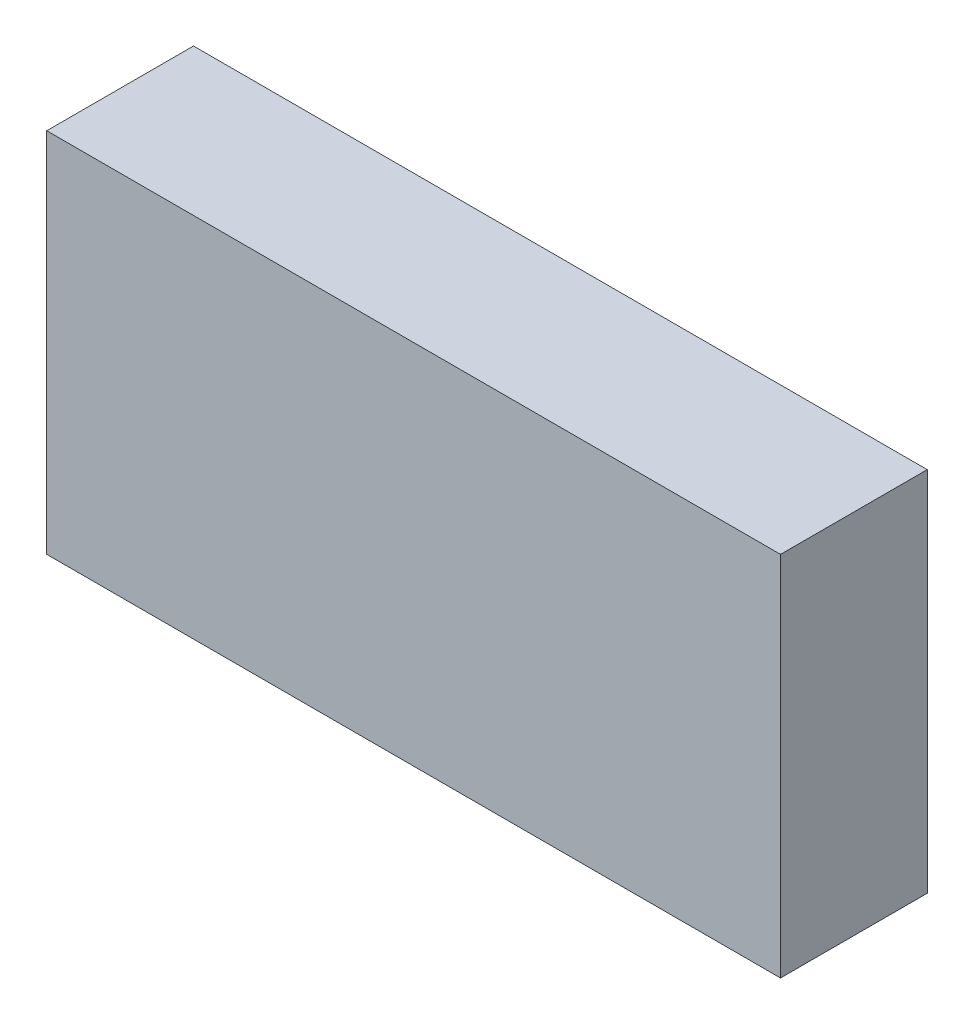
ISO-10303-21;
HEADER;
FILE_DESCRIPTION(('STEP AP214'),'2;1');
FILE_NAME('part.step','',(''),(''),'','','');
FILE_SCHEMA(('AUTOMOTIVE_DESIGN { 1 0 10303 214 1 1 1 1 }'));
ENDSEC;
DATA;
#1=APPLICATION_CONTEXT('core data for automotive mechanical design processes');
#2=APPLICATION_PROTOCOL_DEFINITION('international standard','automotive_design',2000,#1);
#3=PRODUCT_CONTEXT('',#1,'mechanical');
#4=PRODUCT('Part','Part','',(#3));
#5=PRODUCT_RELATED_PRODUCT_CATEGORY('part','',(#4));
#6=PRODUCT_DEFINITION_FORMATION('','',#4);
#7=PRODUCT_DEFINITION_CONTEXT('part definition',#1,'design');
#8=PRODUCT_DEFINITION('design','',#6,#7);
#9=PRODUCT_DEFINITION_SHAPE('','',#8);
#10=(LENGTH_UNIT() NAMED_UNIT(*) SI_UNIT(.MILLI.,.METRE.));
#11=(NAMED_UNIT(*) PLANE_ANGLE_UNIT() SI_UNIT($,.RADIAN.));
#12=(NAMED_UNIT(*) SI_UNIT($,.STERADIAN.) SOLID_ANGLE_UNIT());
#13=UNCERTAINTY_MEASURE_WITH_UNIT(LENGTH_MEASURE(1.E-05),#10,'distance_accuracy_value','');
#14=(GEOMETRIC_REPRESENTATION_CONTEXT(3) GLOBAL_UNCERTAINTY_ASSIGNED_CONTEXT((#13)) GLOBAL_UNIT_ASSIGNED_CONTEXT((#10,
#11,#12)) REPRESENTATION_CONTEXT('',''));
#15=CARTESIAN_POINT('',(0.,0.,0.));
#16=DIRECTION('',(0.,0.,1.));
#17=DIRECTION('',(1.,0.,0.));
#18=AXIS2_PLACEMENT_3D('',#15,#16,#17);
#19=CARTESIAN_POINT('',(-50.,25.,20.));
#20=DIRECTION('',(1.,0.,0.));
#21=DIRECTION('',(0.,1.,0.));
#22=AXIS2_PLACEMENT_3D('',#19,#20,#21);
#23=PLANE('',#22);
#24=DIRECTION('',(0.,-1.,0.));
#25=VECTOR('',#24,1.);
#26=CARTESIAN_POINT('',(-50.,25.,0.));
#27=LINE('',#26,#25);
#28=CARTESIAN_POINT('',(-50.,25.,0.));
#29=VERTEX_POINT('',#28);
#30=CARTESIAN_POINT('',(-50.,-25.,0.));
#31=VERTEX_POINT('',#30);
#32=EDGE_CURVE('E107',#29,#31,#27,.T.);
#33=ORIENTED_EDGE('',*,*,#32,.T.);
#34=DIRECTION('',(0.,0.,-1.));
#35=VECTOR('',#34,1.);
#36=CARTESIAN_POINT('',(-50.,-25.,20.));
#37=LINE('',#36,#35);
#38=CARTESIAN_POINT('',(-50.,-25.,20.));
#39=VERTEX_POINT('',#38);
#40=EDGE_CURVE('E11',#39,#31,#37,.T.);
#41=ORIENTED_EDGE('',*,*,#40,.F.);
#42=DIRECTION('',(0.,-1.,0.));
#43=VECTOR('',#42,1.);
#44=CARTESIAN_POINT('',(-50.,25.,20.));
#45=LINE('',#44,#43);
#46=CARTESIAN_POINT('',(-50.,25.,20.));
#47=VERTEX_POINT('',#46);
#48=EDGE_CURVE('E91',#47,#39,#45,.T.);
#49=ORIENTED_EDGE('',*,*,#48,.F.);
#50=DIRECTION('',(0.,0.,-1.));
#51=VECTOR('',#50,1.);
#52=CARTESIAN_POINT('',(-50.,25.,20.));
#53=LINE('',#52,#51);
#54=EDGE_CURVE('E103',#47,#29,#53,.T.);
#55=ORIENTED_EDGE('',*,*,#54,.T.);
#56=EDGE_LOOP('',(#33,#41,#49,#55));
#57=FACE_BOUND('',#56,.T.);
#58=ADVANCED_FACE('F39',(#57),#23,.F.);
#59=CARTESIAN_POINT('',(-50.,-25.,20.));
#60=DIRECTION('',(0.,1.,0.));
#61=DIRECTION('',(-1.,0.,0.));
#62=AXIS2_PLACEMENT_3D('',#59,#60,#61);
#63=PLANE('',#62);
#64=DIRECTION('',(1.,0.,0.));
#65=VECTOR('',#64,1.);
#66=CARTESIAN_POINT('',(-50.,-25.,0.));
#67=LINE('',#66,#65);
#68=CARTESIAN_POINT('',(50.,-25.,0.));
#69=VERTEX_POINT('',#68);
#70=EDGE_CURVE('E96',#31,#69,#67,.T.);
#71=ORIENTED_EDGE('',*,*,#70,.T.);
#72=DIRECTION('',(0.,0.,-1.));
#73=VECTOR('',#72,1.);
#74=CARTESIAN_POINT('',(50.,-25.,20.));
#75=LINE('',#74,#73);
#76=CARTESIAN_POINT('',(50.,-25.,20.));
#77=VERTEX_POINT('',#76);
#78=EDGE_CURVE('E48',#77,#69,#75,.T.);
#79=ORIENTED_EDGE('',*,*,#78,.F.);
#80=DIRECTION('',(1.,0.,0.));
#81=VECTOR('',#80,1.);
#82=CARTESIAN_POINT('',(-50.,-25.,20.));
#83=LINE('',#82,#81);
#84=EDGE_CURVE('E86',#39,#77,#83,.T.);
#85=ORIENTED_EDGE('',*,*,#84,.F.);
#86=ORIENTED_EDGE('',*,*,#40,.T.);
#87=EDGE_LOOP('',(#71,#79,#85,#86));
#88=FACE_BOUND('',#87,.T.);
#89=ADVANCED_FACE('F95',(#88),#63,.F.);
#90=CARTESIAN_POINT('',(50.,25.,20.));
#91=DIRECTION('',(-1.,0.,0.));
#92=DIRECTION('',(0.,0.,1.));
#93=AXIS2_PLACEMENT_3D('',#90,#91,#92);
#94=PLANE('',#93);
#95=DIRECTION('',(0.,1.,0.));
#96=VECTOR('',#95,1.);
#97=CARTESIAN_POINT('',(50.,25.,0.));
#98=LINE('',#97,#96);
#99=CARTESIAN_POINT('',(50.,25.,0.));
#100=VERTEX_POINT('',#99);
#101=EDGE_CURVE('E73',#69,#100,#98,.T.);
#102=ORIENTED_EDGE('',*,*,#101,.T.);
#103=DIRECTION('',(0.,0.,-1.));
#104=VECTOR('',#103,1.);
#105=CARTESIAN_POINT('',(50.,25.,20.));
#106=LINE('',#105,#104);
#107=CARTESIAN_POINT('',(50.,25.,20.));
#108=VERTEX_POINT('',#107);
#109=EDGE_CURVE('E98',#108,#100,#106,.T.);
#110=ORIENTED_EDGE('',*,*,#109,.F.);
#111=DIRECTION('',(0.,1.,0.));
#112=VECTOR('',#111,1.);
#113=CARTESIAN_POINT('',(50.,25.,20.));
#114=LINE('',#113,#112);
#115=EDGE_CURVE('E89',#77,#108,#114,.T.);
#116=ORIENTED_EDGE('',*,*,#115,.F.);
#117=ORIENTED_EDGE('',*,*,#78,.T.);
#118=EDGE_LOOP('',(#102,#110,#116,#117));
#119=FACE_BOUND('',#118,.T.);
#120=ADVANCED_FACE('F99',(#119),#94,.F.);
#121=CARTESIAN_POINT('',(-50.,25.,20.));
#122=DIRECTION('',(0.,-1.,0.));
#123=DIRECTION('',(0.,0.,-1.));
#124=AXIS2_PLACEMENT_3D('',#121,#122,#123);
#125=PLANE('',#124);
#126=DIRECTION('',(-1.,0.,0.));
#127=VECTOR('',#126,1.);
#128=CARTESIAN_POINT('',(-50.,25.,0.));
#129=LINE('',#128,#127);
#130=EDGE_CURVE('E79',#100,#29,#129,.T.);
#131=ORIENTED_EDGE('',*,*,#130,.T.);
#132=ORIENTED_EDGE('',*,*,#54,.F.);
#133=DIRECTION('',(-1.,0.,0.));
#134=VECTOR('',#133,1.);
#135=CARTESIAN_POINT('',(-50.,25.,20.));
#136=LINE('',#135,#134);
#137=EDGE_CURVE('E56',#108,#47,#136,.T.);
#138=ORIENTED_EDGE('',*,*,#137,.F.);
#139=ORIENTED_EDGE('',*,*,#109,.T.);
#140=EDGE_LOOP('',(#131,#132,#138,#139));
#141=FACE_BOUND('',#140,.T.);
#142=ADVANCED_FACE('F120',(#141),#125,.F.);
#143=CARTESIAN_POINT('',(0.,0.,20.));
#144=DIRECTION('',(0.,0.,1.));
#145=DIRECTION('',(1.,0.,0.));
#146=AXIS2_PLACEMENT_3D('',#143,#144,#145);
#147=PLANE('',#146);
#148=ORIENTED_EDGE('',*,*,#48,.T.);
#149=ORIENTED_EDGE('',*,*,#84,.T.);
#150=ORIENTED_EDGE('',*,*,#115,.T.);
#151=ORIENTED_EDGE('',*,*,#137,.T.);
#152=EDGE_LOOP('',(#148,#149,#150,#151));
#153=FACE_BOUND('',#152,.T.);
#154=ADVANCED_FACE('F87',(#153),#147,.T.);
#155=CARTESIAN_POINT('',(0.,0.,0.));
#156=DIRECTION('',(0.,0.,1.));
#157=DIRECTION('',(1.,0.,0.));
#158=AXIS2_PLACEMENT_3D('',#155,#156,#157);
#159=PLANE('',#158);
#160=ORIENTED_EDGE('',*,*,#32,.F.);
#161=ORIENTED_EDGE('',*,*,#130,.F.);
#162=ORIENTED_EDGE('',*,*,#101,.F.);
#163=ORIENTED_EDGE('',*,*,#70,.F.);
#164=EDGE_LOOP('',(#160,#161,#162,#163));
#165=FACE_BOUND('',#164,.T.);
#166=ADVANCED_FACE('F123',(#165),#159,.F.);
#167=CLOSED_SHELL('',(#58,#89,#120,#142,#154,#166));
#168=MANIFOLD_SOLID_BREP('B2',#167);
#169=ADVANCED_BREP_SHAPE_REPRESENTATION('',(#18,#168),#14);
#170=SHAPE_DEFINITION_REPRESENTATION(#9,#169);
ENDSEC;
END-ISO-10303-21;
